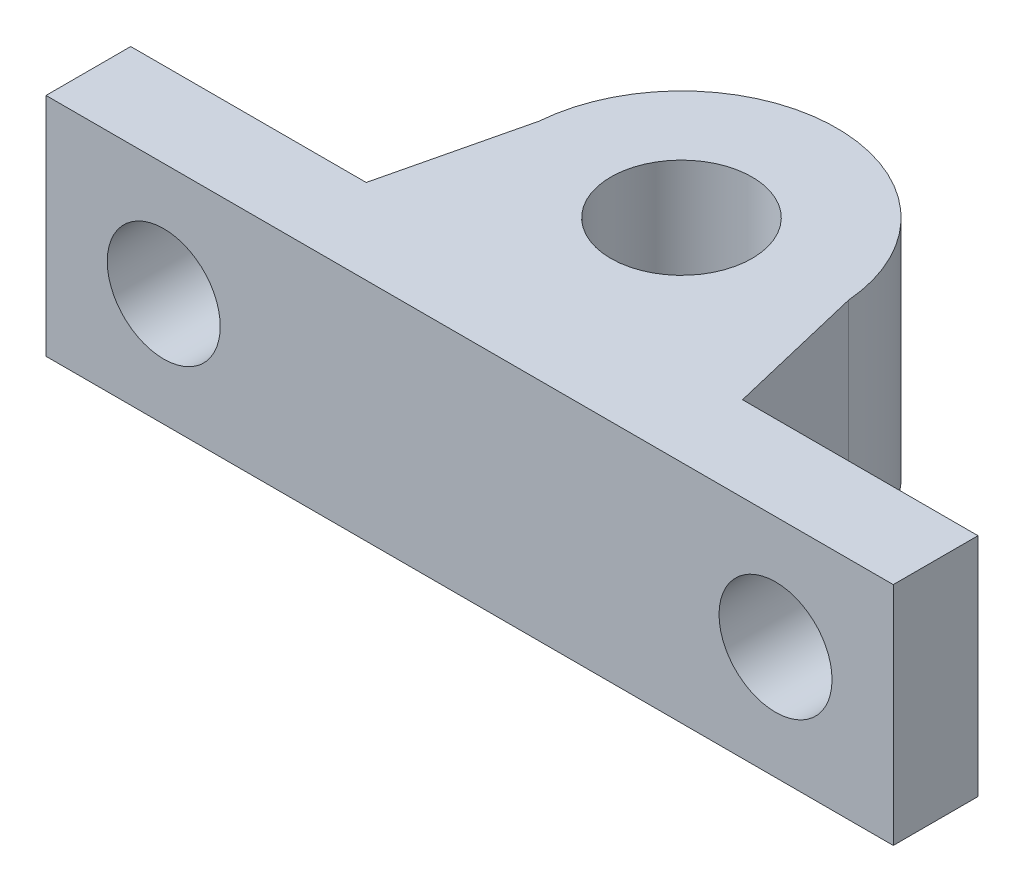
ISO-10303-21;
HEADER;
FILE_DESCRIPTION(('STEP AP214'),'2;1');
FILE_NAME('part.step','',(''),(''),'','','');
FILE_SCHEMA(('AUTOMOTIVE_DESIGN { 1 0 10303 214 1 1 1 1 }'));
ENDSEC;
DATA;
#1=APPLICATION_CONTEXT('core data for automotive mechanical design processes');
#2=APPLICATION_PROTOCOL_DEFINITION('international standard','automotive_design',2000,#1);
#3=PRODUCT_CONTEXT('',#1,'mechanical');
#4=PRODUCT('Part','Part','',(#3));
#5=PRODUCT_RELATED_PRODUCT_CATEGORY('part','',(#4));
#6=PRODUCT_DEFINITION_FORMATION('','',#4);
#7=PRODUCT_DEFINITION_CONTEXT('part definition',#1,'design');
#8=PRODUCT_DEFINITION('design','',#6,#7);
#9=PRODUCT_DEFINITION_SHAPE('','',#8);
#10=(LENGTH_UNIT() NAMED_UNIT(*) SI_UNIT(.MILLI.,.METRE.));
#11=(NAMED_UNIT(*) PLANE_ANGLE_UNIT() SI_UNIT($,.RADIAN.));
#12=(NAMED_UNIT(*) SI_UNIT($,.STERADIAN.) SOLID_ANGLE_UNIT());
#13=UNCERTAINTY_MEASURE_WITH_UNIT(LENGTH_MEASURE(1.E-05),#10,'distance_accuracy_value','');
#14=(GEOMETRIC_REPRESENTATION_CONTEXT(3) GLOBAL_UNCERTAINTY_ASSIGNED_CONTEXT((#13)) GLOBAL_UNIT_ASSIGNED_CONTEXT((#10,
#11,#12)) REPRESENTATION_CONTEXT('',''));
#15=CARTESIAN_POINT('',(0.,0.,0.));
#16=DIRECTION('',(0.,0.,1.));
#17=DIRECTION('',(1.,0.,0.));
#18=AXIS2_PLACEMENT_3D('',#15,#16,#17);
#19=CARTESIAN_POINT('',(0.,0.,7.5));
#20=DIRECTION('',(0.,0.,1.));
#21=DIRECTION('',(1.,0.,0.));
#22=AXIS2_PLACEMENT_3D('',#19,#20,#21);
#23=PLANE('',#22);
#24=CARTESIAN_POINT('',(-10.8311390223695,4.,7.5));
#25=DIRECTION('',(0.,0.,1.));
#26=DIRECTION('',(1.,0.,0.));
#27=AXIS2_PLACEMENT_3D('',#24,#25,#26);
#28=CIRCLE('',#27,2.);
#29=CARTESIAN_POINT('',(-8.83113902236951,4.,7.5));
#30=VERTEX_POINT('',#29);
#31=EDGE_CURVE('E157',#30,#30,#28,.F.);
#32=ORIENTED_EDGE('',*,*,#31,.T.);
#33=EDGE_LOOP('',(#32));
#34=FACE_BOUND('',#33,.T.);
#35=DIRECTION('',(1.,0.,0.));
#36=VECTOR('',#35,1.);
#37=CARTESIAN_POINT('',(0.,8.,7.5));
#38=LINE('',#37,#36);
#39=CARTESIAN_POINT('',(-15.,8.,7.5));
#40=VERTEX_POINT('',#39);
#41=CARTESIAN_POINT('',(15.,8.,7.5));
#42=VERTEX_POINT('',#41);
#43=EDGE_CURVE('E171',#40,#42,#38,.T.);
#44=ORIENTED_EDGE('',*,*,#43,.F.);
#45=DIRECTION('',(0.,1.,0.));
#46=VECTOR('',#45,1.);
#47=CARTESIAN_POINT('',(-15.,0.,7.5));
#48=LINE('',#47,#46);
#49=CARTESIAN_POINT('',(-15.,0.,7.5));
#50=VERTEX_POINT('',#49);
#51=EDGE_CURVE('E131',#50,#40,#48,.T.);
#52=ORIENTED_EDGE('',*,*,#51,.F.);
#53=DIRECTION('',(1.,0.,0.));
#54=VECTOR('',#53,1.);
#55=CARTESIAN_POINT('',(0.,0.,7.5));
#56=LINE('',#55,#54);
#57=CARTESIAN_POINT('',(15.,0.,7.5));
#58=VERTEX_POINT('',#57);
#59=EDGE_CURVE('E145',#50,#58,#56,.T.);
#60=ORIENTED_EDGE('',*,*,#59,.T.);
#61=DIRECTION('',(0.,1.,0.));
#62=VECTOR('',#61,1.);
#63=CARTESIAN_POINT('',(15.,0.,7.5));
#64=LINE('',#63,#62);
#65=EDGE_CURVE('E98',#58,#42,#64,.T.);
#66=ORIENTED_EDGE('',*,*,#65,.T.);
#67=EDGE_LOOP('',(#44,#52,#60,#66));
#68=FACE_BOUND('',#67,.T.);
#69=CARTESIAN_POINT('',(10.8311390223695,4.,7.5));
#70=DIRECTION('',(0.,0.,1.));
#71=DIRECTION('',(1.,0.,0.));
#72=AXIS2_PLACEMENT_3D('',#69,#70,#71);
#73=CIRCLE('',#72,2.);
#74=CARTESIAN_POINT('',(12.8311390223695,4.,7.5));
#75=VERTEX_POINT('',#74);
#76=EDGE_CURVE('E260',#75,#75,#73,.T.);
#77=ORIENTED_EDGE('',*,*,#76,.F.);
#78=EDGE_LOOP('',(#77));
#79=FACE_BOUND('',#78,.T.);
#80=ADVANCED_FACE('F45',(#34,#68,#79),#23,.T.);
#81=CARTESIAN_POINT('',(0.,8.,0.));
#82=DIRECTION('',(0.,1.,0.));
#83=DIRECTION('',(0.,0.,1.));
#84=AXIS2_PLACEMENT_3D('',#81,#82,#83);
#85=PLANE('',#84);
#86=CARTESIAN_POINT('',(0.,8.,0.));
#87=DIRECTION('',(0.,1.,0.));
#88=DIRECTION('',(0.,0.,1.));
#89=AXIS2_PLACEMENT_3D('',#86,#87,#88);
#90=CIRCLE('',#89,5.5);
#91=CARTESIAN_POINT('',(5.48230840037238,8.,-0.440788615105345));
#92=VERTEX_POINT('',#91);
#93=CARTESIAN_POINT('',(-5.48230840037238,8.,-0.440788615105359));
#94=VERTEX_POINT('',#93);
#95=EDGE_CURVE('E11',#92,#94,#90,.T.);
#96=ORIENTED_EDGE('',*,*,#95,.T.);
#97=DIRECTION('',(-0.232289548766721,0.,0.972646680729315));
#98=VECTOR('',#97,1.);
#99=CARTESIAN_POINT('',(-5.28608148787379,8.,-1.26243322255683));
#100=LINE('',#99,#98);
#101=CARTESIAN_POINT('',(-6.66227804473903,8.,4.5));
#102=VERTEX_POINT('',#101);
#103=EDGE_CURVE('E162',#94,#102,#100,.T.);
#104=ORIENTED_EDGE('',*,*,#103,.T.);
#105=DIRECTION('',(1.,0.,0.));
#106=VECTOR('',#105,1.);
#107=CARTESIAN_POINT('',(0.,8.,4.5));
#108=LINE('',#107,#106);
#109=CARTESIAN_POINT('',(-15.,8.,4.5));
#110=VERTEX_POINT('',#109);
#111=EDGE_CURVE('E166',#110,#102,#108,.T.);
#112=ORIENTED_EDGE('',*,*,#111,.F.);
#113=DIRECTION('',(0.,0.,1.));
#114=VECTOR('',#113,1.);
#115=CARTESIAN_POINT('',(-15.,8.,0.));
#116=LINE('',#115,#114);
#117=EDGE_CURVE('E126',#110,#40,#116,.T.);
#118=ORIENTED_EDGE('',*,*,#117,.T.);
#119=ORIENTED_EDGE('',*,*,#43,.T.);
#120=DIRECTION('',(0.,0.,1.));
#121=VECTOR('',#120,1.);
#122=CARTESIAN_POINT('',(15.,8.,0.));
#123=LINE('',#122,#121);
#124=CARTESIAN_POINT('',(15.,8.,4.5));
#125=VERTEX_POINT('',#124);
#126=EDGE_CURVE('E153',#125,#42,#123,.T.);
#127=ORIENTED_EDGE('',*,*,#126,.F.);
#128=DIRECTION('',(1.,0.,0.));
#129=VECTOR('',#128,1.);
#130=CARTESIAN_POINT('',(0.,8.,4.5));
#131=LINE('',#130,#129);
#132=CARTESIAN_POINT('',(6.66227804473903,8.,4.5));
#133=VERTEX_POINT('',#132);
#134=EDGE_CURVE('E156',#133,#125,#131,.T.);
#135=ORIENTED_EDGE('',*,*,#134,.F.);
#136=DIRECTION('',(0.232289548766721,0.,0.972646680729315));
#137=VECTOR('',#136,1.);
#138=CARTESIAN_POINT('',(5.28608148787378,8.,-1.26243322255683));
#139=LINE('',#138,#137);
#140=EDGE_CURVE('E60',#92,#133,#139,.T.);
#141=ORIENTED_EDGE('',*,*,#140,.F.);
#142=EDGE_LOOP('',(#96,#104,#112,#118,#119,#127,#135,#141));
#143=FACE_BOUND('',#142,.T.);
#144=CARTESIAN_POINT('',(0.,8.,0.));
#145=DIRECTION('',(0.,1.,0.));
#146=DIRECTION('',(0.,0.,1.));
#147=AXIS2_PLACEMENT_3D('',#144,#145,#146);
#148=CIRCLE('',#147,2.5);
#149=CARTESIAN_POINT('',(0.,8.,2.5));
#150=VERTEX_POINT('',#149);
#151=EDGE_CURVE('E196',#150,#150,#148,.T.);
#152=ORIENTED_EDGE('',*,*,#151,.F.);
#153=EDGE_LOOP('',(#152));
#154=FACE_BOUND('',#153,.T.);
#155=ADVANCED_FACE('F218',(#143,#154),#85,.T.);
#156=CARTESIAN_POINT('',(0.,0.,0.));
#157=DIRECTION('',(0.,1.,0.));
#158=DIRECTION('',(0.,0.,1.));
#159=AXIS2_PLACEMENT_3D('',#156,#157,#158);
#160=PLANE('',#159);
#161=CARTESIAN_POINT('',(0.,0.,0.));
#162=DIRECTION('',(0.,1.,0.));
#163=DIRECTION('',(0.,0.,1.));
#164=AXIS2_PLACEMENT_3D('',#161,#162,#163);
#165=CIRCLE('',#164,5.5);
#166=CARTESIAN_POINT('',(5.48230840037238,0.,-0.440788615105345));
#167=VERTEX_POINT('',#166);
#168=CARTESIAN_POINT('',(-5.48230840037238,0.,-0.440788615105359));
#169=VERTEX_POINT('',#168);
#170=EDGE_CURVE('E49',#167,#169,#165,.T.);
#171=ORIENTED_EDGE('',*,*,#170,.F.);
#172=DIRECTION('',(0.232289548766721,0.,0.972646680729315));
#173=VECTOR('',#172,1.);
#174=CARTESIAN_POINT('',(5.28608148787378,0.,-1.26243322255683));
#175=LINE('',#174,#173);
#176=CARTESIAN_POINT('',(6.66227804473903,0.,4.5));
#177=VERTEX_POINT('',#176);
#178=EDGE_CURVE('E274',#167,#177,#175,.T.);
#179=ORIENTED_EDGE('',*,*,#178,.T.);
#180=DIRECTION('',(1.,0.,0.));
#181=VECTOR('',#180,1.);
#182=CARTESIAN_POINT('',(0.,0.,4.5));
#183=LINE('',#182,#181);
#184=CARTESIAN_POINT('',(15.,0.,4.5));
#185=VERTEX_POINT('',#184);
#186=EDGE_CURVE('E104',#177,#185,#183,.T.);
#187=ORIENTED_EDGE('',*,*,#186,.T.);
#188=DIRECTION('',(0.,0.,1.));
#189=VECTOR('',#188,1.);
#190=CARTESIAN_POINT('',(15.,0.,0.));
#191=LINE('',#190,#189);
#192=EDGE_CURVE('E69',#185,#58,#191,.T.);
#193=ORIENTED_EDGE('',*,*,#192,.T.);
#194=ORIENTED_EDGE('',*,*,#59,.F.);
#195=DIRECTION('',(0.,0.,1.));
#196=VECTOR('',#195,1.);
#197=CARTESIAN_POINT('',(-15.,0.,0.));
#198=LINE('',#197,#196);
#199=CARTESIAN_POINT('',(-15.,0.,4.5));
#200=VERTEX_POINT('',#199);
#201=EDGE_CURVE('E124',#200,#50,#198,.T.);
#202=ORIENTED_EDGE('',*,*,#201,.F.);
#203=DIRECTION('',(1.,0.,0.));
#204=VECTOR('',#203,1.);
#205=CARTESIAN_POINT('',(0.,0.,4.5));
#206=LINE('',#205,#204);
#207=CARTESIAN_POINT('',(-6.66227804473903,0.,4.5));
#208=VERTEX_POINT('',#207);
#209=EDGE_CURVE('E135',#200,#208,#206,.T.);
#210=ORIENTED_EDGE('',*,*,#209,.T.);
#211=DIRECTION('',(-0.232289548766721,0.,0.972646680729315));
#212=VECTOR('',#211,1.);
#213=CARTESIAN_POINT('',(-5.28608148787379,0.,-1.26243322255683));
#214=LINE('',#213,#212);
#215=EDGE_CURVE('E140',#169,#208,#214,.T.);
#216=ORIENTED_EDGE('',*,*,#215,.F.);
#217=EDGE_LOOP('',(#171,#179,#187,#193,#194,#202,#210,#216));
#218=FACE_BOUND('',#217,.T.);
#219=CARTESIAN_POINT('',(0.,0.,0.));
#220=DIRECTION('',(0.,1.,0.));
#221=DIRECTION('',(0.,0.,1.));
#222=AXIS2_PLACEMENT_3D('',#219,#220,#221);
#223=CIRCLE('',#222,2.5);
#224=CARTESIAN_POINT('',(0.,0.,2.5));
#225=VERTEX_POINT('',#224);
#226=EDGE_CURVE('E177',#225,#225,#223,.T.);
#227=ORIENTED_EDGE('',*,*,#226,.T.);
#228=EDGE_LOOP('',(#227));
#229=FACE_BOUND('',#228,.T.);
#230=ADVANCED_FACE('F143',(#218,#229),#160,.F.);
#231=CARTESIAN_POINT('',(0.,8.,0.));
#232=DIRECTION('',(0.,-1.,0.));
#233=DIRECTION('',(0.,0.,-1.));
#234=AXIS2_PLACEMENT_3D('',#231,#232,#233);
#235=CYLINDRICAL_SURFACE('',#234,5.5);
#236=ORIENTED_EDGE('',*,*,#170,.T.);
#237=DIRECTION('',(0.,1.,0.));
#238=VECTOR('',#237,1.);
#239=CARTESIAN_POINT('',(-5.48230840037238,0.,-0.440788615105359));
#240=LINE('',#239,#238);
#241=EDGE_CURVE('E182',#169,#94,#240,.T.);
#242=ORIENTED_EDGE('',*,*,#241,.T.);
#243=ORIENTED_EDGE('',*,*,#95,.F.);
#244=DIRECTION('',(0.,1.,0.));
#245=VECTOR('',#244,1.);
#246=CARTESIAN_POINT('',(5.48230840037238,0.,-0.440788615105345));
#247=LINE('',#246,#245);
#248=EDGE_CURVE('E186',#167,#92,#247,.T.);
#249=ORIENTED_EDGE('',*,*,#248,.F.);
#250=EDGE_LOOP('',(#236,#242,#243,#249));
#251=FACE_BOUND('',#250,.T.);
#252=ADVANCED_FACE('F47',(#251),#235,.T.);
#253=CARTESIAN_POINT('',(0.,8.,0.));
#254=DIRECTION('',(0.,-1.,0.));
#255=DIRECTION('',(0.,0.,-1.));
#256=AXIS2_PLACEMENT_3D('',#253,#254,#255);
#257=CYLINDRICAL_SURFACE('',#256,2.5);
#258=ORIENTED_EDGE('',*,*,#151,.T.);
#259=EDGE_LOOP('',(#258));
#260=FACE_BOUND('',#259,.T.);
#261=ORIENTED_EDGE('',*,*,#226,.F.);
#262=EDGE_LOOP('',(#261));
#263=FACE_BOUND('',#262,.T.);
#264=ADVANCED_FACE('F204',(#260,#263),#257,.F.);
#265=CARTESIAN_POINT('',(15.,0.,0.));
#266=DIRECTION('',(-1.,0.,0.));
#267=DIRECTION('',(0.,0.,1.));
#268=AXIS2_PLACEMENT_3D('',#265,#266,#267);
#269=PLANE('',#268);
#270=ORIENTED_EDGE('',*,*,#126,.T.);
#271=ORIENTED_EDGE('',*,*,#65,.F.);
#272=ORIENTED_EDGE('',*,*,#192,.F.);
#273=DIRECTION('',(0.,1.,0.));
#274=VECTOR('',#273,1.);
#275=CARTESIAN_POINT('',(15.,0.,4.5));
#276=LINE('',#275,#274);
#277=EDGE_CURVE('E149',#185,#125,#276,.T.);
#278=ORIENTED_EDGE('',*,*,#277,.T.);
#279=EDGE_LOOP('',(#270,#271,#272,#278));
#280=FACE_BOUND('',#279,.T.);
#281=ADVANCED_FACE('F206',(#280),#269,.F.);
#282=CARTESIAN_POINT('',(-15.,0.,0.));
#283=DIRECTION('',(-1.,0.,0.));
#284=DIRECTION('',(0.,0.,1.));
#285=AXIS2_PLACEMENT_3D('',#282,#283,#284);
#286=PLANE('',#285);
#287=ORIENTED_EDGE('',*,*,#117,.F.);
#288=DIRECTION('',(0.,1.,0.));
#289=VECTOR('',#288,1.);
#290=CARTESIAN_POINT('',(-15.,0.,4.5));
#291=LINE('',#290,#289);
#292=EDGE_CURVE('E120',#200,#110,#291,.T.);
#293=ORIENTED_EDGE('',*,*,#292,.F.);
#294=ORIENTED_EDGE('',*,*,#201,.T.);
#295=ORIENTED_EDGE('',*,*,#51,.T.);
#296=EDGE_LOOP('',(#287,#293,#294,#295));
#297=FACE_BOUND('',#296,.T.);
#298=ADVANCED_FACE('F122',(#297),#286,.T.);
#299=CARTESIAN_POINT('',(0.,0.,4.5));
#300=DIRECTION('',(0.,0.,1.));
#301=DIRECTION('',(1.,0.,0.));
#302=AXIS2_PLACEMENT_3D('',#299,#300,#301);
#303=PLANE('',#302);
#304=CARTESIAN_POINT('',(-10.8311390223695,4.,4.5));
#305=DIRECTION('',(0.,0.,-1.));
#306=DIRECTION('',(-1.,0.,0.));
#307=AXIS2_PLACEMENT_3D('',#304,#305,#306);
#308=CIRCLE('',#307,2.);
#309=CARTESIAN_POINT('',(-12.8311390223695,4.,4.5));
#310=VERTEX_POINT('',#309);
#311=EDGE_CURVE('E266',#310,#310,#308,.F.);
#312=ORIENTED_EDGE('',*,*,#311,.T.);
#313=EDGE_LOOP('',(#312));
#314=FACE_BOUND('',#313,.T.);
#315=ORIENTED_EDGE('',*,*,#111,.T.);
#316=DIRECTION('',(0.,1.,0.));
#317=VECTOR('',#316,1.);
#318=CARTESIAN_POINT('',(-6.66227804473903,0.,4.5));
#319=LINE('',#318,#317);
#320=EDGE_CURVE('E132',#208,#102,#319,.T.);
#321=ORIENTED_EDGE('',*,*,#320,.F.);
#322=ORIENTED_EDGE('',*,*,#209,.F.);
#323=ORIENTED_EDGE('',*,*,#292,.T.);
#324=EDGE_LOOP('',(#315,#321,#322,#323));
#325=FACE_BOUND('',#324,.T.);
#326=ADVANCED_FACE('F136',(#314,#325),#303,.F.);
#327=CARTESIAN_POINT('',(-5.28608148787379,0.,-1.26243322255683));
#328=DIRECTION('',(-0.972646680729315,0.,-0.232289548766721));
#329=DIRECTION('',(-0.232289548766721,0.,0.972646680729315));
#330=AXIS2_PLACEMENT_3D('',#327,#328,#329);
#331=PLANE('',#330);
#332=ORIENTED_EDGE('',*,*,#103,.F.);
#333=ORIENTED_EDGE('',*,*,#241,.F.);
#334=ORIENTED_EDGE('',*,*,#215,.T.);
#335=ORIENTED_EDGE('',*,*,#320,.T.);
#336=EDGE_LOOP('',(#332,#333,#334,#335));
#337=FACE_BOUND('',#336,.T.);
#338=ADVANCED_FACE('F233',(#337),#331,.T.);
#339=CARTESIAN_POINT('',(5.28608148787378,0.,-1.26243322255683));
#340=DIRECTION('',(-0.972646680729315,0.,0.232289548766721));
#341=DIRECTION('',(0.232289548766721,0.,0.972646680729315));
#342=AXIS2_PLACEMENT_3D('',#339,#340,#341);
#343=PLANE('',#342);
#344=ORIENTED_EDGE('',*,*,#140,.T.);
#345=DIRECTION('',(0.,1.,0.));
#346=VECTOR('',#345,1.);
#347=CARTESIAN_POINT('',(6.66227804473903,0.,4.5));
#348=LINE('',#347,#346);
#349=EDGE_CURVE('E189',#177,#133,#348,.T.);
#350=ORIENTED_EDGE('',*,*,#349,.F.);
#351=ORIENTED_EDGE('',*,*,#178,.F.);
#352=ORIENTED_EDGE('',*,*,#248,.T.);
#353=EDGE_LOOP('',(#344,#350,#351,#352));
#354=FACE_BOUND('',#353,.T.);
#355=ADVANCED_FACE('F237',(#354),#343,.F.);
#356=CARTESIAN_POINT('',(0.,0.,4.5));
#357=DIRECTION('',(0.,0.,1.));
#358=DIRECTION('',(1.,0.,0.));
#359=AXIS2_PLACEMENT_3D('',#356,#357,#358);
#360=PLANE('',#359);
#361=CARTESIAN_POINT('',(10.8311390223695,4.,4.5));
#362=DIRECTION('',(0.,0.,-1.));
#363=DIRECTION('',(-1.,0.,0.));
#364=AXIS2_PLACEMENT_3D('',#361,#362,#363);
#365=CIRCLE('',#364,2.);
#366=CARTESIAN_POINT('',(8.83113902236951,4.,4.5));
#367=VERTEX_POINT('',#366);
#368=EDGE_CURVE('E253',#367,#367,#365,.T.);
#369=ORIENTED_EDGE('',*,*,#368,.F.);
#370=EDGE_LOOP('',(#369));
#371=FACE_BOUND('',#370,.T.);
#372=ORIENTED_EDGE('',*,*,#134,.T.);
#373=ORIENTED_EDGE('',*,*,#277,.F.);
#374=ORIENTED_EDGE('',*,*,#186,.F.);
#375=ORIENTED_EDGE('',*,*,#349,.T.);
#376=EDGE_LOOP('',(#372,#373,#374,#375));
#377=FACE_BOUND('',#376,.T.);
#378=ADVANCED_FACE('F241',(#371,#377),#360,.F.);
#379=CARTESIAN_POINT('',(10.8311390223695,4.,12.5));
#380=DIRECTION('',(0.,0.,-1.));
#381=DIRECTION('',(-1.,0.,0.));
#382=AXIS2_PLACEMENT_3D('',#379,#380,#381);
#383=CYLINDRICAL_SURFACE('',#382,2.);
#384=ORIENTED_EDGE('',*,*,#76,.T.);
#385=EDGE_LOOP('',(#384));
#386=FACE_BOUND('',#385,.T.);
#387=ORIENTED_EDGE('',*,*,#368,.T.);
#388=EDGE_LOOP('',(#387));
#389=FACE_BOUND('',#388,.T.);
#390=ADVANCED_FACE('F244',(#386,#389),#383,.F.);
#391=CARTESIAN_POINT('',(-10.8311390223695,4.,12.5));
#392=DIRECTION('',(0.,0.,-1.));
#393=DIRECTION('',(-1.,0.,0.));
#394=AXIS2_PLACEMENT_3D('',#391,#392,#393);
#395=CYLINDRICAL_SURFACE('',#394,2.);
#396=ORIENTED_EDGE('',*,*,#31,.F.);
#397=EDGE_LOOP('',(#396));
#398=FACE_BOUND('',#397,.T.);
#399=ORIENTED_EDGE('',*,*,#311,.F.);
#400=EDGE_LOOP('',(#399));
#401=FACE_BOUND('',#400,.T.);
#402=ADVANCED_FACE('F227',(#398,#401),#395,.F.);
#403=CLOSED_SHELL('',(#80,#155,#230,#252,#264,#281,#298,#326,#338,#355,#378,#390,#402));
#404=MANIFOLD_SOLID_BREP('B2',#403);
#405=ADVANCED_BREP_SHAPE_REPRESENTATION('',(#18,#404),#14);
#406=SHAPE_DEFINITION_REPRESENTATION(#9,#405);
ENDSEC;
END-ISO-10303-21;
